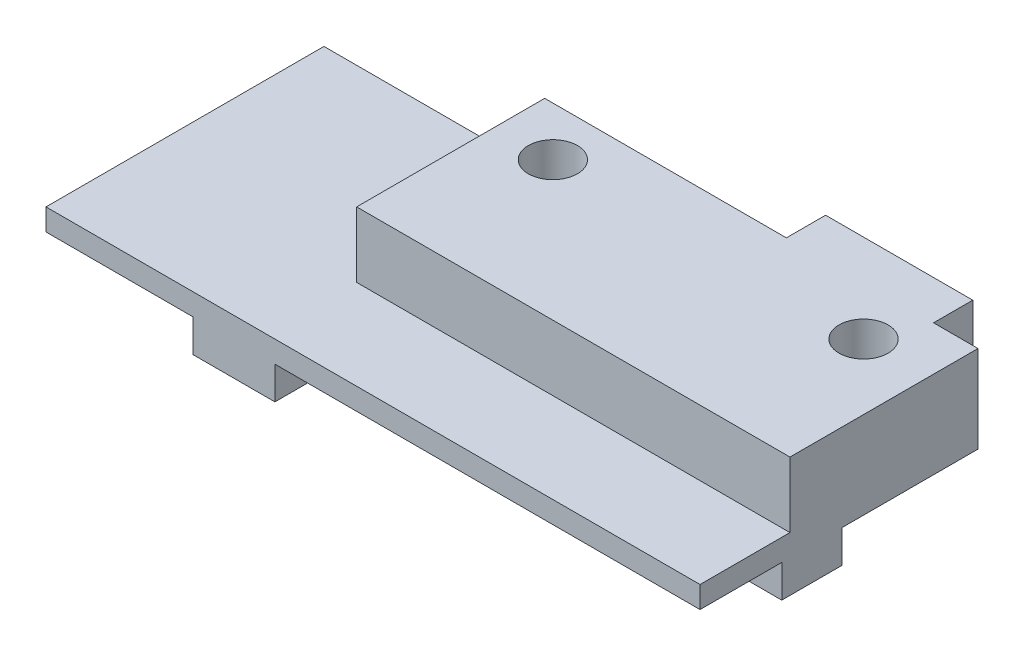
ISO-10303-21;
HEADER;
FILE_DESCRIPTION(('STEP AP214'),'2;1');
FILE_NAME('part.step','',(''),(''),'','','');
FILE_SCHEMA(('AUTOMOTIVE_DESIGN { 1 0 10303 214 1 1 1 1 }'));
ENDSEC;
DATA;
#1=APPLICATION_CONTEXT('core data for automotive mechanical design processes');
#2=APPLICATION_PROTOCOL_DEFINITION('international standard','automotive_design',2000,#1);
#3=PRODUCT_CONTEXT('',#1,'mechanical');
#4=PRODUCT('Part','Part','',(#3));
#5=PRODUCT_RELATED_PRODUCT_CATEGORY('part','',(#4));
#6=PRODUCT_DEFINITION_FORMATION('','',#4);
#7=PRODUCT_DEFINITION_CONTEXT('part definition',#1,'design');
#8=PRODUCT_DEFINITION('design','',#6,#7);
#9=PRODUCT_DEFINITION_SHAPE('','',#8);
#10=(LENGTH_UNIT() NAMED_UNIT(*) SI_UNIT(.MILLI.,.METRE.));
#11=(NAMED_UNIT(*) PLANE_ANGLE_UNIT() SI_UNIT($,.RADIAN.));
#12=(NAMED_UNIT(*) SI_UNIT($,.STERADIAN.) SOLID_ANGLE_UNIT());
#13=UNCERTAINTY_MEASURE_WITH_UNIT(LENGTH_MEASURE(1.E-05),#10,'distance_accuracy_value','');
#14=(GEOMETRIC_REPRESENTATION_CONTEXT(3) GLOBAL_UNCERTAINTY_ASSIGNED_CONTEXT((#13)) GLOBAL_UNIT_ASSIGNED_CONTEXT((#10,
#11,#12)) REPRESENTATION_CONTEXT('',''));
#15=CARTESIAN_POINT('',(0.,0.,0.));
#16=DIRECTION('',(0.,0.,1.));
#17=DIRECTION('',(1.,0.,0.));
#18=AXIS2_PLACEMENT_3D('',#15,#16,#17);
#19=CARTESIAN_POINT('',(0.,0.,0.));
#20=DIRECTION('',(0.,1.,0.));
#21=DIRECTION('',(0.,0.,1.));
#22=AXIS2_PLACEMENT_3D('',#19,#20,#21);
#23=PLANE('',#22);
#24=DIRECTION('',(0.,0.,1.));
#25=VECTOR('',#24,1.);
#26=CARTESIAN_POINT('',(-5.99999999999998,0.,0.));
#27=LINE('',#26,#25);
#28=CARTESIAN_POINT('',(-5.99999999999997,0.,3.5));
#29=VERTEX_POINT('',#28);
#30=CARTESIAN_POINT('',(-5.99999999999998,0.,8.5));
#31=VERTEX_POINT('',#30);
#32=EDGE_CURVE('E80',#29,#31,#27,.T.);
#33=ORIENTED_EDGE('',*,*,#32,.F.);
#34=DIRECTION('',(-1.,0.,0.));
#35=VECTOR('',#34,1.);
#36=CARTESIAN_POINT('',(20.,0.,3.5));
#37=LINE('',#36,#35);
#38=CARTESIAN_POINT('',(20.,0.,3.5));
#39=VERTEX_POINT('',#38);
#40=EDGE_CURVE('E267',#39,#29,#37,.T.);
#41=ORIENTED_EDGE('',*,*,#40,.F.);
#42=DIRECTION('',(0.,0.,-1.));
#43=VECTOR('',#42,1.);
#44=CARTESIAN_POINT('',(20.,0.,-8.5));
#45=LINE('',#44,#43);
#46=CARTESIAN_POINT('',(20.,0.,8.5));
#47=VERTEX_POINT('',#46);
#48=EDGE_CURVE('E299',#47,#39,#45,.T.);
#49=ORIENTED_EDGE('',*,*,#48,.F.);
#50=DIRECTION('',(1.,0.,0.));
#51=VECTOR('',#50,1.);
#52=CARTESIAN_POINT('',(-20.,0.,8.5));
#53=LINE('',#52,#51);
#54=EDGE_CURVE('E375',#31,#47,#53,.T.);
#55=ORIENTED_EDGE('',*,*,#54,.F.);
#56=EDGE_LOOP('',(#33,#41,#49,#55));
#57=FACE_BOUND('',#56,.T.);
#58=ADVANCED_FACE('F63',(#57),#23,.F.);
#59=DIRECTION('',(-1.,0.,0.));
#60=VECTOR('',#59,1.);
#61=CARTESIAN_POINT('',(-20.,0.,-8.5));
#62=LINE('',#61,#60);
#63=CARTESIAN_POINT('',(-11.,0.,-8.5));
#64=VERTEX_POINT('',#63);
#65=CARTESIAN_POINT('',(-20.,0.,-8.5));
#66=VERTEX_POINT('',#65);
#67=EDGE_CURVE('E88',#64,#66,#62,.T.);
#68=ORIENTED_EDGE('',*,*,#67,.F.);
#69=DIRECTION('',(0.,0.,1.));
#70=VECTOR('',#69,1.);
#71=CARTESIAN_POINT('',(-11.,0.,0.));
#72=LINE('',#71,#70);
#73=CARTESIAN_POINT('',(-11.,0.,8.5));
#74=VERTEX_POINT('',#73);
#75=EDGE_CURVE('E202',#64,#74,#72,.T.);
#76=ORIENTED_EDGE('',*,*,#75,.T.);
#77=CARTESIAN_POINT('',(-20.,0.,8.5));
#78=VERTEX_POINT('',#77);
#79=EDGE_CURVE('E376',#78,#74,#53,.T.);
#80=ORIENTED_EDGE('',*,*,#79,.F.);
#81=DIRECTION('',(0.,0.,1.));
#82=VECTOR('',#81,1.);
#83=CARTESIAN_POINT('',(-20.,0.,-8.5));
#84=LINE('',#83,#82);
#85=EDGE_CURVE('E368',#66,#78,#84,.T.);
#86=ORIENTED_EDGE('',*,*,#85,.F.);
#87=EDGE_LOOP('',(#68,#76,#80,#86));
#88=FACE_BOUND('',#87,.T.);
#89=ADVANCED_FACE('F291',(#88),#23,.F.);
#90=CARTESIAN_POINT('',(0.,1.33,0.));
#91=DIRECTION('',(0.,1.,0.));
#92=DIRECTION('',(0.,0.,1.));
#93=AXIS2_PLACEMENT_3D('',#90,#91,#92);
#94=PLANE('',#93);
#95=DIRECTION('',(0.,0.,-1.));
#96=VECTOR('',#95,1.);
#97=CARTESIAN_POINT('',(20.,1.33,-8.5));
#98=LINE('',#97,#96);
#99=CARTESIAN_POINT('',(20.,1.33,8.5));
#100=VERTEX_POINT('',#99);
#101=CARTESIAN_POINT('',(20.,1.33,3.));
#102=VERTEX_POINT('',#101);
#103=EDGE_CURVE('E388',#100,#102,#98,.T.);
#104=ORIENTED_EDGE('',*,*,#103,.T.);
#105=DIRECTION('',(-1.,0.,0.));
#106=VECTOR('',#105,1.);
#107=CARTESIAN_POINT('',(0.,1.33,3.));
#108=LINE('',#107,#106);
#109=CARTESIAN_POINT('',(-6.49999999999998,1.33,3.00000000000001));
#110=VERTEX_POINT('',#109);
#111=EDGE_CURVE('E325',#102,#110,#108,.T.);
#112=ORIENTED_EDGE('',*,*,#111,.T.);
#113=DIRECTION('',(0.,0.,1.));
#114=VECTOR('',#113,1.);
#115=CARTESIAN_POINT('',(-6.49999999999998,1.33,0.));
#116=LINE('',#115,#114);
#117=CARTESIAN_POINT('',(-6.49999999999998,1.33,-8.5));
#118=VERTEX_POINT('',#117);
#119=EDGE_CURVE('E355',#118,#110,#116,.T.);
#120=ORIENTED_EDGE('',*,*,#119,.F.);
#121=DIRECTION('',(-1.,0.,0.));
#122=VECTOR('',#121,1.);
#123=CARTESIAN_POINT('',(-20.,1.33,-8.5));
#124=LINE('',#123,#122);
#125=CARTESIAN_POINT('',(-20.,1.33,-8.5));
#126=VERTEX_POINT('',#125);
#127=EDGE_CURVE('E391',#118,#126,#124,.T.);
#128=ORIENTED_EDGE('',*,*,#127,.T.);
#129=DIRECTION('',(0.,0.,1.));
#130=VECTOR('',#129,1.);
#131=CARTESIAN_POINT('',(-20.,1.33,-8.5));
#132=LINE('',#131,#130);
#133=CARTESIAN_POINT('',(-20.,1.33,8.5));
#134=VERTEX_POINT('',#133);
#135=EDGE_CURVE('E399',#126,#134,#132,.T.);
#136=ORIENTED_EDGE('',*,*,#135,.T.);
#137=DIRECTION('',(1.,0.,0.));
#138=VECTOR('',#137,1.);
#139=CARTESIAN_POINT('',(-20.,1.33,8.5));
#140=LINE('',#139,#138);
#141=EDGE_CURVE('E363',#134,#100,#140,.T.);
#142=ORIENTED_EDGE('',*,*,#141,.T.);
#143=EDGE_LOOP('',(#104,#112,#120,#128,#136,#142));
#144=FACE_BOUND('',#143,.T.);
#145=ADVANCED_FACE('F443',(#144),#94,.T.);
#146=CARTESIAN_POINT('',(20.,1.33,-8.5));
#147=DIRECTION('',(-1.,0.,0.));
#148=DIRECTION('',(0.,0.,1.));
#149=AXIS2_PLACEMENT_3D('',#146,#147,#148);
#150=PLANE('',#149);
#151=ORIENTED_EDGE('',*,*,#48,.T.);
#152=DIRECTION('',(0.,1.,0.));
#153=VECTOR('',#152,1.);
#154=CARTESIAN_POINT('',(20.,-2.,3.5));
#155=LINE('',#154,#153);
#156=CARTESIAN_POINT('',(20.,-2.,3.5));
#157=VERTEX_POINT('',#156);
#158=EDGE_CURVE('E245',#157,#39,#155,.T.);
#159=ORIENTED_EDGE('',*,*,#158,.F.);
#160=DIRECTION('',(0.,0.,1.));
#161=VECTOR('',#160,1.);
#162=CARTESIAN_POINT('',(20.,-2.,-0.189999999999996));
#163=LINE('',#162,#161);
#164=CARTESIAN_POINT('',(20.,-2.,-0.189999999999996));
#165=VERTEX_POINT('',#164);
#166=EDGE_CURVE('E306',#165,#157,#163,.T.);
#167=ORIENTED_EDGE('',*,*,#166,.F.);
#168=DIRECTION('',(0.,1.,0.));
#169=VECTOR('',#168,1.);
#170=CARTESIAN_POINT('',(20.,-2.,-0.189999999999996));
#171=LINE('',#170,#169);
#172=CARTESIAN_POINT('',(20.,0.,-0.189999999999997));
#173=VERTEX_POINT('',#172);
#174=EDGE_CURVE('E258',#165,#173,#171,.T.);
#175=ORIENTED_EDGE('',*,*,#174,.T.);
#176=CARTESIAN_POINT('',(20.,0.,-8.5));
#177=VERTEX_POINT('',#176);
#178=EDGE_CURVE('E294',#173,#177,#45,.T.);
#179=ORIENTED_EDGE('',*,*,#178,.T.);
#180=DIRECTION('',(0.,-1.,0.));
#181=VECTOR('',#180,1.);
#182=CARTESIAN_POINT('',(20.,1.33,-8.5));
#183=LINE('',#182,#181);
#184=CARTESIAN_POINT('',(20.,5.33,-8.5));
#185=VERTEX_POINT('',#184);
#186=EDGE_CURVE('E12',#185,#177,#183,.T.);
#187=ORIENTED_EDGE('',*,*,#186,.F.);
#188=DIRECTION('',(0.,0.,-1.));
#189=VECTOR('',#188,1.);
#190=CARTESIAN_POINT('',(20.,5.33,0.));
#191=LINE('',#190,#189);
#192=CARTESIAN_POINT('',(20.,5.33,3.));
#193=VERTEX_POINT('',#192);
#194=EDGE_CURVE('E339',#193,#185,#191,.T.);
#195=ORIENTED_EDGE('',*,*,#194,.F.);
#196=DIRECTION('',(0.,-1.,0.));
#197=VECTOR('',#196,1.);
#198=CARTESIAN_POINT('',(20.,5.33,3.));
#199=LINE('',#198,#197);
#200=EDGE_CURVE('E342',#193,#102,#199,.T.);
#201=ORIENTED_EDGE('',*,*,#200,.T.);
#202=ORIENTED_EDGE('',*,*,#103,.F.);
#203=DIRECTION('',(0.,-1.,0.));
#204=VECTOR('',#203,1.);
#205=CARTESIAN_POINT('',(20.,1.33,8.5));
#206=LINE('',#205,#204);
#207=EDGE_CURVE('E379',#100,#47,#206,.T.);
#208=ORIENTED_EDGE('',*,*,#207,.T.);
#209=EDGE_LOOP('',(#151,#159,#167,#175,#179,#187,#195,#201,#202,#208));
#210=FACE_BOUND('',#209,.T.);
#211=ADVANCED_FACE('F65',(#210),#150,.F.);
#212=CARTESIAN_POINT('',(-20.,1.33,-8.5));
#213=DIRECTION('',(0.,0.,1.));
#214=DIRECTION('',(1.,0.,0.));
#215=AXIS2_PLACEMENT_3D('',#212,#213,#214);
#216=PLANE('',#215);
#217=CARTESIAN_POINT('',(-5.99999999999998,0.,-8.5));
#218=VERTEX_POINT('',#217);
#219=EDGE_CURVE('E297',#177,#218,#62,.T.);
#220=ORIENTED_EDGE('',*,*,#219,.T.);
#221=DIRECTION('',(0.,1.,0.));
#222=VECTOR('',#221,1.);
#223=CARTESIAN_POINT('',(-5.99999999999998,-2.,-8.5));
#224=LINE('',#223,#222);
#225=CARTESIAN_POINT('',(-5.99999999999998,-2.,-8.5));
#226=VERTEX_POINT('',#225);
#227=EDGE_CURVE('E205',#226,#218,#224,.T.);
#228=ORIENTED_EDGE('',*,*,#227,.F.);
#229=DIRECTION('',(1.,0.,0.));
#230=VECTOR('',#229,1.);
#231=CARTESIAN_POINT('',(0.,-2.,-8.5));
#232=LINE('',#231,#230);
#233=CARTESIAN_POINT('',(-11.,-2.,-8.5));
#234=VERTEX_POINT('',#233);
#235=EDGE_CURVE('E208',#234,#226,#232,.T.);
#236=ORIENTED_EDGE('',*,*,#235,.F.);
#237=DIRECTION('',(0.,1.,0.));
#238=VECTOR('',#237,1.);
#239=CARTESIAN_POINT('',(-11.,-2.,-8.5));
#240=LINE('',#239,#238);
#241=EDGE_CURVE('E196',#234,#64,#240,.T.);
#242=ORIENTED_EDGE('',*,*,#241,.T.);
#243=ORIENTED_EDGE('',*,*,#67,.T.);
#244=DIRECTION('',(0.,-1.,0.));
#245=VECTOR('',#244,1.);
#246=CARTESIAN_POINT('',(-20.,1.33,-8.5));
#247=LINE('',#246,#245);
#248=EDGE_CURVE('E72',#126,#66,#247,.T.);
#249=ORIENTED_EDGE('',*,*,#248,.F.);
#250=ORIENTED_EDGE('',*,*,#127,.F.);
#251=DIRECTION('',(0.,-1.,0.));
#252=VECTOR('',#251,1.);
#253=CARTESIAN_POINT('',(-6.49999999999998,5.33,-8.5));
#254=LINE('',#253,#252);
#255=CARTESIAN_POINT('',(-6.49999999999998,5.33,-8.5));
#256=VERTEX_POINT('',#255);
#257=EDGE_CURVE('E406',#256,#118,#254,.T.);
#258=ORIENTED_EDGE('',*,*,#257,.F.);
#259=DIRECTION('',(-1.,0.,0.));
#260=VECTOR('',#259,1.);
#261=CARTESIAN_POINT('',(0.,5.33,-8.5));
#262=LINE('',#261,#260);
#263=CARTESIAN_POINT('',(8.28000000000002,5.33,-8.5));
#264=VERTEX_POINT('',#263);
#265=EDGE_CURVE('E326',#264,#256,#262,.T.);
#266=ORIENTED_EDGE('',*,*,#265,.F.);
#267=DIRECTION('',(0.,-1.,0.));
#268=VECTOR('',#267,1.);
#269=CARTESIAN_POINT('',(8.28000000000002,5.33,-8.5));
#270=LINE('',#269,#268);
#271=CARTESIAN_POINT('',(8.28000000000002,1.33,-8.5));
#272=VERTEX_POINT('',#271);
#273=EDGE_CURVE('E409',#264,#272,#270,.T.);
#274=ORIENTED_EDGE('',*,*,#273,.T.);
#275=CARTESIAN_POINT('',(17.28,1.33,-8.5));
#276=VERTEX_POINT('',#275);
#277=EDGE_CURVE('E392',#276,#272,#124,.T.);
#278=ORIENTED_EDGE('',*,*,#277,.F.);
#279=DIRECTION('',(0.,-1.,0.));
#280=VECTOR('',#279,1.);
#281=CARTESIAN_POINT('',(17.28,5.33,-8.5));
#282=LINE('',#281,#280);
#283=CARTESIAN_POINT('',(17.28,5.33,-8.5));
#284=VERTEX_POINT('',#283);
#285=EDGE_CURVE('E300',#284,#276,#282,.T.);
#286=ORIENTED_EDGE('',*,*,#285,.F.);
#287=EDGE_CURVE('E321',#185,#284,#262,.T.);
#288=ORIENTED_EDGE('',*,*,#287,.F.);
#289=ORIENTED_EDGE('',*,*,#186,.T.);
#290=EDGE_LOOP('',(#220,#228,#236,#242,#243,#249,#250,#258,#266,#274,#278,#286,#288,#289));
#291=FACE_BOUND('',#290,.T.);
#292=ADVANCED_FACE('F210',(#291),#216,.F.);
#293=CARTESIAN_POINT('',(-20.,1.33,-8.5));
#294=DIRECTION('',(1.,0.,0.));
#295=DIRECTION('',(0.,0.,-1.));
#296=AXIS2_PLACEMENT_3D('',#293,#294,#295);
#297=PLANE('',#296);
#298=ORIENTED_EDGE('',*,*,#85,.T.);
#299=DIRECTION('',(0.,-1.,0.));
#300=VECTOR('',#299,1.);
#301=CARTESIAN_POINT('',(-20.,1.33,8.5));
#302=LINE('',#301,#300);
#303=EDGE_CURVE('E383',#134,#78,#302,.T.);
#304=ORIENTED_EDGE('',*,*,#303,.F.);
#305=ORIENTED_EDGE('',*,*,#135,.F.);
#306=ORIENTED_EDGE('',*,*,#248,.T.);
#307=EDGE_LOOP('',(#298,#304,#305,#306));
#308=FACE_BOUND('',#307,.T.);
#309=ADVANCED_FACE('F449',(#308),#297,.F.);
#310=CARTESIAN_POINT('',(-20.,1.33,8.5));
#311=DIRECTION('',(0.,0.,-1.));
#312=DIRECTION('',(-1.,0.,0.));
#313=AXIS2_PLACEMENT_3D('',#310,#311,#312);
#314=PLANE('',#313);
#315=ORIENTED_EDGE('',*,*,#79,.T.);
#316=DIRECTION('',(0.,1.,0.));
#317=VECTOR('',#316,1.);
#318=CARTESIAN_POINT('',(-11.,-2.,8.5));
#319=LINE('',#318,#317);
#320=CARTESIAN_POINT('',(-11.,-2.,8.5));
#321=VERTEX_POINT('',#320);
#322=EDGE_CURVE('E247',#321,#74,#319,.T.);
#323=ORIENTED_EDGE('',*,*,#322,.F.);
#324=DIRECTION('',(-1.,0.,0.));
#325=VECTOR('',#324,1.);
#326=CARTESIAN_POINT('',(0.,-2.,8.5));
#327=LINE('',#326,#325);
#328=CARTESIAN_POINT('',(-5.99999999999998,-2.,8.5));
#329=VERTEX_POINT('',#328);
#330=EDGE_CURVE('E219',#329,#321,#327,.T.);
#331=ORIENTED_EDGE('',*,*,#330,.F.);
#332=DIRECTION('',(0.,1.,0.));
#333=VECTOR('',#332,1.);
#334=CARTESIAN_POINT('',(-5.99999999999998,-2.,8.5));
#335=LINE('',#334,#333);
#336=EDGE_CURVE('E249',#329,#31,#335,.T.);
#337=ORIENTED_EDGE('',*,*,#336,.T.);
#338=ORIENTED_EDGE('',*,*,#54,.T.);
#339=ORIENTED_EDGE('',*,*,#207,.F.);
#340=ORIENTED_EDGE('',*,*,#141,.F.);
#341=ORIENTED_EDGE('',*,*,#303,.T.);
#342=EDGE_LOOP('',(#315,#323,#331,#337,#338,#339,#340,#341));
#343=FACE_BOUND('',#342,.T.);
#344=ADVANCED_FACE('F289',(#343),#314,.F.);
#345=CARTESIAN_POINT('',(-2.99999999999998,0.,-5.5));
#346=DIRECTION('',(0.,-1.,0.));
#347=DIRECTION('',(0.,0.,-1.));
#348=AXIS2_PLACEMENT_3D('',#345,#346,#347);
#349=CIRCLE('',#348,1.5);
#350=CARTESIAN_POINT('',(-2.99999999999998,0.,-7.));
#351=VERTEX_POINT('',#350);
#352=EDGE_CURVE('E277',#351,#351,#349,.T.);
#353=ORIENTED_EDGE('',*,*,#352,.F.);
#354=EDGE_LOOP('',(#353));
#355=FACE_BOUND('',#354,.T.);
#356=CARTESIAN_POINT('',(16.,0.,-5.5));
#357=DIRECTION('',(0.,-1.,0.));
#358=DIRECTION('',(0.,0.,-1.));
#359=AXIS2_PLACEMENT_3D('',#356,#357,#358);
#360=CIRCLE('',#359,1.5);
#361=CARTESIAN_POINT('',(16.,0.,-7.));
#362=VERTEX_POINT('',#361);
#363=EDGE_CURVE('E226',#362,#362,#360,.T.);
#364=ORIENTED_EDGE('',*,*,#363,.F.);
#365=EDGE_LOOP('',(#364));
#366=FACE_BOUND('',#365,.T.);
#367=ORIENTED_EDGE('',*,*,#178,.F.);
#368=DIRECTION('',(-1.,0.,0.));
#369=VECTOR('',#368,1.);
#370=CARTESIAN_POINT('',(20.,0.,-0.189999999999996));
#371=LINE('',#370,#369);
#372=CARTESIAN_POINT('',(-5.99999999999998,0.,-0.189999999999999));
#373=VERTEX_POINT('',#372);
#374=EDGE_CURVE('E271',#173,#373,#371,.T.);
#375=ORIENTED_EDGE('',*,*,#374,.T.);
#376=EDGE_CURVE('E221',#218,#373,#27,.T.);
#377=ORIENTED_EDGE('',*,*,#376,.F.);
#378=ORIENTED_EDGE('',*,*,#219,.F.);
#379=EDGE_LOOP('',(#367,#375,#377,#378));
#380=FACE_BOUND('',#379,.T.);
#381=ADVANCED_FACE('F285',(#355,#366,#380),#23,.F.);
#382=CARTESIAN_POINT('',(0.,1.33,0.));
#383=DIRECTION('',(0.,1.,0.));
#384=DIRECTION('',(0.,0.,1.));
#385=AXIS2_PLACEMENT_3D('',#382,#383,#384);
#386=PLANE('',#385);
#387=DIRECTION('',(0.,0.,-1.));
#388=VECTOR('',#387,1.);
#389=CARTESIAN_POINT('',(17.28,1.33,0.));
#390=LINE('',#389,#388);
#391=CARTESIAN_POINT('',(17.28,1.33,-10.9));
#392=VERTEX_POINT('',#391);
#393=EDGE_CURVE('E347',#276,#392,#390,.T.);
#394=ORIENTED_EDGE('',*,*,#393,.F.);
#395=ORIENTED_EDGE('',*,*,#277,.T.);
#396=DIRECTION('',(0.,0.,-1.));
#397=VECTOR('',#396,1.);
#398=CARTESIAN_POINT('',(8.28000000000002,1.33,0.));
#399=LINE('',#398,#397);
#400=CARTESIAN_POINT('',(8.28000000000002,1.33,-10.9));
#401=VERTEX_POINT('',#400);
#402=EDGE_CURVE('E346',#272,#401,#399,.T.);
#403=ORIENTED_EDGE('',*,*,#402,.T.);
#404=DIRECTION('',(1.,0.,0.));
#405=VECTOR('',#404,1.);
#406=CARTESIAN_POINT('',(0.,1.33,-10.9));
#407=LINE('',#406,#405);
#408=EDGE_CURVE('E343',#401,#392,#407,.T.);
#409=ORIENTED_EDGE('',*,*,#408,.T.);
#410=EDGE_LOOP('',(#394,#395,#403,#409));
#411=FACE_BOUND('',#410,.T.);
#412=ADVANCED_FACE('F288',(#411),#386,.F.);
#413=CARTESIAN_POINT('',(17.28,5.33,0.));
#414=DIRECTION('',(-1.,0.,0.));
#415=DIRECTION('',(0.,0.,1.));
#416=AXIS2_PLACEMENT_3D('',#413,#414,#415);
#417=PLANE('',#416);
#418=ORIENTED_EDGE('',*,*,#393,.T.);
#419=DIRECTION('',(0.,-1.,0.));
#420=VECTOR('',#419,1.);
#421=CARTESIAN_POINT('',(17.28,5.33,-10.9));
#422=LINE('',#421,#420);
#423=CARTESIAN_POINT('',(17.28,5.33,-10.9));
#424=VERTEX_POINT('',#423);
#425=EDGE_CURVE('E397',#424,#392,#422,.T.);
#426=ORIENTED_EDGE('',*,*,#425,.F.);
#427=DIRECTION('',(0.,0.,-1.));
#428=VECTOR('',#427,1.);
#429=CARTESIAN_POINT('',(17.28,5.33,0.));
#430=LINE('',#429,#428);
#431=EDGE_CURVE('E324',#284,#424,#430,.T.);
#432=ORIENTED_EDGE('',*,*,#431,.F.);
#433=ORIENTED_EDGE('',*,*,#285,.T.);
#434=EDGE_LOOP('',(#418,#426,#432,#433));
#435=FACE_BOUND('',#434,.T.);
#436=ADVANCED_FACE('F464',(#435),#417,.F.);
#437=CARTESIAN_POINT('',(0.,5.33,-10.9));
#438=DIRECTION('',(0.,0.,-1.));
#439=DIRECTION('',(-1.,0.,0.));
#440=AXIS2_PLACEMENT_3D('',#437,#438,#439);
#441=PLANE('',#440);
#442=ORIENTED_EDGE('',*,*,#408,.F.);
#443=DIRECTION('',(0.,-1.,0.));
#444=VECTOR('',#443,1.);
#445=CARTESIAN_POINT('',(8.28000000000002,5.33,-10.9));
#446=LINE('',#445,#444);
#447=CARTESIAN_POINT('',(8.28000000000002,5.33,-10.9));
#448=VERTEX_POINT('',#447);
#449=EDGE_CURVE('E414',#448,#401,#446,.T.);
#450=ORIENTED_EDGE('',*,*,#449,.F.);
#451=DIRECTION('',(1.,0.,0.));
#452=VECTOR('',#451,1.);
#453=CARTESIAN_POINT('',(0.,5.33,-10.9));
#454=LINE('',#453,#452);
#455=EDGE_CURVE('E328',#448,#424,#454,.T.);
#456=ORIENTED_EDGE('',*,*,#455,.T.);
#457=ORIENTED_EDGE('',*,*,#425,.T.);
#458=EDGE_LOOP('',(#442,#450,#456,#457));
#459=FACE_BOUND('',#458,.T.);
#460=ADVANCED_FACE('F461',(#459),#441,.T.);
#461=CARTESIAN_POINT('',(8.28000000000002,5.33,0.));
#462=DIRECTION('',(-1.,0.,0.));
#463=DIRECTION('',(0.,0.,1.));
#464=AXIS2_PLACEMENT_3D('',#461,#462,#463);
#465=PLANE('',#464);
#466=ORIENTED_EDGE('',*,*,#402,.F.);
#467=ORIENTED_EDGE('',*,*,#273,.F.);
#468=DIRECTION('',(0.,0.,-1.));
#469=VECTOR('',#468,1.);
#470=CARTESIAN_POINT('',(8.28000000000002,5.33,0.));
#471=LINE('',#470,#469);
#472=EDGE_CURVE('E331',#264,#448,#471,.T.);
#473=ORIENTED_EDGE('',*,*,#472,.T.);
#474=ORIENTED_EDGE('',*,*,#449,.T.);
#475=EDGE_LOOP('',(#466,#467,#473,#474));
#476=FACE_BOUND('',#475,.T.);
#477=ADVANCED_FACE('F457',(#476),#465,.T.);
#478=CARTESIAN_POINT('',(-6.49999999999998,5.33,0.));
#479=DIRECTION('',(1.,0.,0.));
#480=DIRECTION('',(0.,0.,-1.));
#481=AXIS2_PLACEMENT_3D('',#478,#479,#480);
#482=PLANE('',#481);
#483=ORIENTED_EDGE('',*,*,#119,.T.);
#484=DIRECTION('',(0.,-1.,0.));
#485=VECTOR('',#484,1.);
#486=CARTESIAN_POINT('',(-6.49999999999998,5.33,3.00000000000001));
#487=LINE('',#486,#485);
#488=CARTESIAN_POINT('',(-6.49999999999998,5.33,3.00000000000001));
#489=VERTEX_POINT('',#488);
#490=EDGE_CURVE('E350',#489,#110,#487,.T.);
#491=ORIENTED_EDGE('',*,*,#490,.F.);
#492=DIRECTION('',(0.,0.,1.));
#493=VECTOR('',#492,1.);
#494=CARTESIAN_POINT('',(-6.49999999999998,5.33,0.));
#495=LINE('',#494,#493);
#496=EDGE_CURVE('E334',#256,#489,#495,.T.);
#497=ORIENTED_EDGE('',*,*,#496,.F.);
#498=ORIENTED_EDGE('',*,*,#257,.T.);
#499=EDGE_LOOP('',(#483,#491,#497,#498));
#500=FACE_BOUND('',#499,.T.);
#501=ADVANCED_FACE('F439',(#500),#482,.F.);
#502=CARTESIAN_POINT('',(0.,5.33,3.));
#503=DIRECTION('',(0.,0.,1.));
#504=DIRECTION('',(1.,0.,0.));
#505=AXIS2_PLACEMENT_3D('',#502,#503,#504);
#506=PLANE('',#505);
#507=ORIENTED_EDGE('',*,*,#111,.F.);
#508=ORIENTED_EDGE('',*,*,#200,.F.);
#509=DIRECTION('',(-1.,0.,0.));
#510=VECTOR('',#509,1.);
#511=CARTESIAN_POINT('',(0.,5.33,3.));
#512=LINE('',#511,#510);
#513=EDGE_CURVE('E336',#193,#489,#512,.T.);
#514=ORIENTED_EDGE('',*,*,#513,.T.);
#515=ORIENTED_EDGE('',*,*,#490,.T.);
#516=EDGE_LOOP('',(#507,#508,#514,#515));
#517=FACE_BOUND('',#516,.T.);
#518=ADVANCED_FACE('F435',(#517),#506,.T.);
#519=CARTESIAN_POINT('',(0.,5.33,0.));
#520=DIRECTION('',(0.,1.,0.));
#521=DIRECTION('',(0.,0.,1.));
#522=AXIS2_PLACEMENT_3D('',#519,#520,#521);
#523=PLANE('',#522);
#524=CARTESIAN_POINT('',(-2.99999999999998,5.33,-5.5));
#525=DIRECTION('',(0.,1.,0.));
#526=DIRECTION('',(0.,0.,1.));
#527=AXIS2_PLACEMENT_3D('',#524,#525,#526);
#528=CIRCLE('',#527,1.5);
#529=CARTESIAN_POINT('',(-2.99999999999998,5.33,-4.));
#530=VERTEX_POINT('',#529);
#531=EDGE_CURVE('E67',#530,#530,#528,.T.);
#532=ORIENTED_EDGE('',*,*,#531,.F.);
#533=EDGE_LOOP('',(#532));
#534=FACE_BOUND('',#533,.T.);
#535=CARTESIAN_POINT('',(16.,5.33,-5.5));
#536=DIRECTION('',(0.,1.,0.));
#537=DIRECTION('',(0.,0.,1.));
#538=AXIS2_PLACEMENT_3D('',#535,#536,#537);
#539=CIRCLE('',#538,1.5);
#540=CARTESIAN_POINT('',(16.,5.33,-4.));
#541=VERTEX_POINT('',#540);
#542=EDGE_CURVE('E265',#541,#541,#539,.T.);
#543=ORIENTED_EDGE('',*,*,#542,.F.);
#544=EDGE_LOOP('',(#543));
#545=FACE_BOUND('',#544,.T.);
#546=ORIENTED_EDGE('',*,*,#287,.T.);
#547=ORIENTED_EDGE('',*,*,#431,.T.);
#548=ORIENTED_EDGE('',*,*,#455,.F.);
#549=ORIENTED_EDGE('',*,*,#472,.F.);
#550=ORIENTED_EDGE('',*,*,#265,.T.);
#551=ORIENTED_EDGE('',*,*,#496,.T.);
#552=ORIENTED_EDGE('',*,*,#513,.F.);
#553=ORIENTED_EDGE('',*,*,#194,.T.);
#554=EDGE_LOOP('',(#546,#547,#548,#549,#550,#551,#552,#553));
#555=FACE_BOUND('',#554,.T.);
#556=ADVANCED_FACE('F467',(#534,#545,#555),#523,.T.);
#557=CARTESIAN_POINT('',(-11.,-2.,0.));
#558=DIRECTION('',(-1.,0.,0.));
#559=DIRECTION('',(0.,0.,1.));
#560=AXIS2_PLACEMENT_3D('',#557,#558,#559);
#561=PLANE('',#560);
#562=ORIENTED_EDGE('',*,*,#75,.F.);
#563=ORIENTED_EDGE('',*,*,#241,.F.);
#564=DIRECTION('',(0.,0.,1.));
#565=VECTOR('',#564,1.);
#566=CARTESIAN_POINT('',(-11.,-2.,0.));
#567=LINE('',#566,#565);
#568=EDGE_CURVE('E201',#234,#321,#567,.T.);
#569=ORIENTED_EDGE('',*,*,#568,.T.);
#570=ORIENTED_EDGE('',*,*,#322,.T.);
#571=EDGE_LOOP('',(#562,#563,#569,#570));
#572=FACE_BOUND('',#571,.T.);
#573=ADVANCED_FACE('F198',(#572),#561,.T.);
#574=CARTESIAN_POINT('',(0.,-2.,0.));
#575=DIRECTION('',(0.,-1.,0.));
#576=DIRECTION('',(0.,0.,-1.));
#577=AXIS2_PLACEMENT_3D('',#574,#575,#576);
#578=PLANE('',#577);
#579=ORIENTED_EDGE('',*,*,#568,.F.);
#580=ORIENTED_EDGE('',*,*,#235,.T.);
#581=DIRECTION('',(0.,0.,1.));
#582=VECTOR('',#581,1.);
#583=CARTESIAN_POINT('',(-5.99999999999998,-2.,0.));
#584=LINE('',#583,#582);
#585=CARTESIAN_POINT('',(-5.99999999999998,-2.,-0.189999999999999));
#586=VERTEX_POINT('',#585);
#587=EDGE_CURVE('E236',#226,#586,#584,.T.);
#588=ORIENTED_EDGE('',*,*,#587,.T.);
#589=DIRECTION('',(-1.,0.,0.));
#590=VECTOR('',#589,1.);
#591=CARTESIAN_POINT('',(20.,-2.,-0.189999999999996));
#592=LINE('',#591,#590);
#593=EDGE_CURVE('E263',#165,#586,#592,.T.);
#594=ORIENTED_EDGE('',*,*,#593,.F.);
#595=ORIENTED_EDGE('',*,*,#166,.T.);
#596=DIRECTION('',(-1.,0.,0.));
#597=VECTOR('',#596,1.);
#598=CARTESIAN_POINT('',(20.,-2.,3.5));
#599=LINE('',#598,#597);
#600=CARTESIAN_POINT('',(-5.99999999999998,-2.,3.5));
#601=VERTEX_POINT('',#600);
#602=EDGE_CURVE('E313',#157,#601,#599,.T.);
#603=ORIENTED_EDGE('',*,*,#602,.T.);
#604=EDGE_CURVE('E215',#601,#329,#584,.T.);
#605=ORIENTED_EDGE('',*,*,#604,.T.);
#606=ORIENTED_EDGE('',*,*,#330,.T.);
#607=EDGE_LOOP('',(#579,#580,#588,#594,#595,#603,#605,#606));
#608=FACE_BOUND('',#607,.T.);
#609=ADVANCED_FACE('F217',(#608),#578,.T.);
#610=CARTESIAN_POINT('',(-5.99999999999998,-2.,0.));
#611=DIRECTION('',(-1.,0.,0.));
#612=DIRECTION('',(0.,0.,1.));
#613=AXIS2_PLACEMENT_3D('',#610,#611,#612);
#614=PLANE('',#613);
#615=ORIENTED_EDGE('',*,*,#604,.F.);
#616=DIRECTION('',(0.,1.,0.));
#617=VECTOR('',#616,1.);
#618=CARTESIAN_POINT('',(-5.99999999999998,-2.,3.5));
#619=LINE('',#618,#617);
#620=EDGE_CURVE('E204',#601,#29,#619,.T.);
#621=ORIENTED_EDGE('',*,*,#620,.T.);
#622=ORIENTED_EDGE('',*,*,#32,.T.);
#623=ORIENTED_EDGE('',*,*,#336,.F.);
#624=EDGE_LOOP('',(#615,#621,#622,#623));
#625=FACE_BOUND('',#624,.T.);
#626=ADVANCED_FACE('F541',(#625),#614,.F.);
#627=DIRECTION('',(0.,1.,0.));
#628=VECTOR('',#627,1.);
#629=CARTESIAN_POINT('',(-5.99999999999998,-2.,-0.189999999999999));
#630=LINE('',#629,#628);
#631=EDGE_CURVE('E311',#586,#373,#630,.T.);
#632=ORIENTED_EDGE('',*,*,#631,.F.);
#633=ORIENTED_EDGE('',*,*,#587,.F.);
#634=ORIENTED_EDGE('',*,*,#227,.T.);
#635=ORIENTED_EDGE('',*,*,#376,.T.);
#636=EDGE_LOOP('',(#632,#633,#634,#635));
#637=FACE_BOUND('',#636,.T.);
#638=ADVANCED_FACE('F551',(#637),#614,.F.);
#639=CARTESIAN_POINT('',(20.,-2.,3.5));
#640=DIRECTION('',(0.,0.,-1.));
#641=DIRECTION('',(-1.,0.,0.));
#642=AXIS2_PLACEMENT_3D('',#639,#640,#641);
#643=PLANE('',#642);
#644=ORIENTED_EDGE('',*,*,#40,.T.);
#645=ORIENTED_EDGE('',*,*,#620,.F.);
#646=ORIENTED_EDGE('',*,*,#602,.F.);
#647=ORIENTED_EDGE('',*,*,#158,.T.);
#648=EDGE_LOOP('',(#644,#645,#646,#647));
#649=FACE_BOUND('',#648,.T.);
#650=ADVANCED_FACE('F562',(#649),#643,.F.);
#651=CARTESIAN_POINT('',(20.,-2.,-0.189999999999996));
#652=DIRECTION('',(0.,0.,-1.));
#653=DIRECTION('',(-1.,0.,0.));
#654=AXIS2_PLACEMENT_3D('',#651,#652,#653);
#655=PLANE('',#654);
#656=ORIENTED_EDGE('',*,*,#374,.F.);
#657=ORIENTED_EDGE('',*,*,#174,.F.);
#658=ORIENTED_EDGE('',*,*,#593,.T.);
#659=ORIENTED_EDGE('',*,*,#631,.T.);
#660=EDGE_LOOP('',(#656,#657,#658,#659));
#661=FACE_BOUND('',#660,.T.);
#662=ADVANCED_FACE('F310',(#661),#655,.T.);
#663=CARTESIAN_POINT('',(16.,5.330025,-5.5));
#664=DIRECTION('',(0.,-1.,0.));
#665=DIRECTION('',(0.,0.,-1.));
#666=AXIS2_PLACEMENT_3D('',#663,#664,#665);
#667=CYLINDRICAL_SURFACE('',#666,1.5);
#668=ORIENTED_EDGE('',*,*,#542,.T.);
#669=EDGE_LOOP('',(#668));
#670=FACE_BOUND('',#669,.T.);
#671=ORIENTED_EDGE('',*,*,#363,.T.);
#672=EDGE_LOOP('',(#671));
#673=FACE_BOUND('',#672,.T.);
#674=ADVANCED_FACE('F579',(#670,#673),#667,.F.);
#675=CARTESIAN_POINT('',(-2.99999999999998,5.330025,-5.5));
#676=DIRECTION('',(0.,-1.,0.));
#677=DIRECTION('',(0.,0.,-1.));
#678=AXIS2_PLACEMENT_3D('',#675,#676,#677);
#679=CYLINDRICAL_SURFACE('',#678,1.5);
#680=ORIENTED_EDGE('',*,*,#531,.T.);
#681=EDGE_LOOP('',(#680));
#682=FACE_BOUND('',#681,.T.);
#683=ORIENTED_EDGE('',*,*,#352,.T.);
#684=EDGE_LOOP('',(#683));
#685=FACE_BOUND('',#684,.T.);
#686=ADVANCED_FACE('F283',(#682,#685),#679,.F.);
#687=CLOSED_SHELL('',(#58,#89,#145,#211,#292,#309,#344,#381,#412,#436,#460,#477,#501,#518,#556,
#573,#609,#626,#638,#650,#662,#674,#686));
#688=MANIFOLD_SOLID_BREP('B2',#687);
#689=ADVANCED_BREP_SHAPE_REPRESENTATION('',(#18,#688),#14);
#690=SHAPE_DEFINITION_REPRESENTATION(#9,#689);
ENDSEC;
END-ISO-10303-21;
